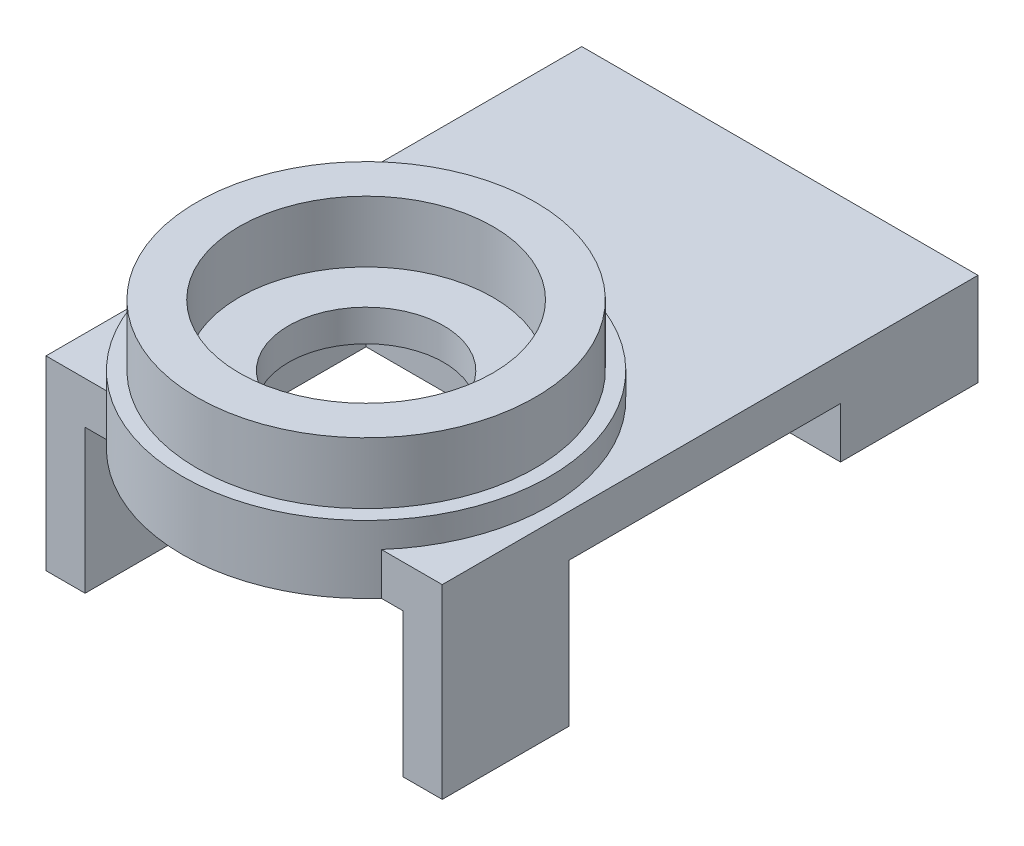
ISO-10303-21;
HEADER;
FILE_DESCRIPTION(('STEP AP214'),'2;1');
FILE_NAME('part.step','',(''),(''),'','','');
FILE_SCHEMA(('AUTOMOTIVE_DESIGN { 1 0 10303 214 1 1 1 1 }'));
ENDSEC;
DATA;
#1=APPLICATION_CONTEXT('core data for automotive mechanical design processes');
#2=APPLICATION_PROTOCOL_DEFINITION('international standard','automotive_design',2000,#1);
#3=PRODUCT_CONTEXT('',#1,'mechanical');
#4=PRODUCT('Part','Part','',(#3));
#5=PRODUCT_RELATED_PRODUCT_CATEGORY('part','',(#4));
#6=PRODUCT_DEFINITION_FORMATION('','',#4);
#7=PRODUCT_DEFINITION_CONTEXT('part definition',#1,'design');
#8=PRODUCT_DEFINITION('design','',#6,#7);
#9=PRODUCT_DEFINITION_SHAPE('','',#8);
#10=(LENGTH_UNIT() NAMED_UNIT(*) SI_UNIT(.MILLI.,.METRE.));
#11=(NAMED_UNIT(*) PLANE_ANGLE_UNIT() SI_UNIT($,.RADIAN.));
#12=(NAMED_UNIT(*) SI_UNIT($,.STERADIAN.) SOLID_ANGLE_UNIT());
#13=UNCERTAINTY_MEASURE_WITH_UNIT(LENGTH_MEASURE(1.E-05),#10,'distance_accuracy_value','');
#14=(GEOMETRIC_REPRESENTATION_CONTEXT(3) GLOBAL_UNCERTAINTY_ASSIGNED_CONTEXT((#13)) GLOBAL_UNIT_ASSIGNED_CONTEXT((#10,
#11,#12)) REPRESENTATION_CONTEXT('',''));
#15=CARTESIAN_POINT('',(0.,0.,0.));
#16=DIRECTION('',(0.,0.,1.));
#17=DIRECTION('',(1.,0.,0.));
#18=AXIS2_PLACEMENT_3D('',#15,#16,#17);
#19=CARTESIAN_POINT('',(0.,-1.7,0.));
#20=DIRECTION('',(0.,1.,0.));
#21=DIRECTION('',(0.,0.,1.));
#22=AXIS2_PLACEMENT_3D('',#19,#20,#21);
#23=PLANE('',#22);
#24=DIRECTION('',(0.,0.,-1.));
#25=VECTOR('',#24,1.);
#26=CARTESIAN_POINT('',(6.20485700421139,-1.7,0.));
#27=LINE('',#26,#25);
#28=CARTESIAN_POINT('',(6.20485700421139,-1.7,6.14875625654059));
#29=VERTEX_POINT('',#28);
#30=CARTESIAN_POINT('',(6.20485700421139,-1.7,-2.19124374345941));
#31=VERTEX_POINT('',#30);
#32=EDGE_CURVE('E283',#29,#31,#27,.T.);
#33=ORIENTED_EDGE('',*,*,#32,.T.);
#34=DIRECTION('',(-1.,0.,0.));
#35=VECTOR('',#34,1.);
#36=CARTESIAN_POINT('',(0.,-1.7,-2.19124374345941));
#37=LINE('',#36,#35);
#38=CARTESIAN_POINT('',(-2.13514299578861,-1.7,-2.19124374345941));
#39=VERTEX_POINT('',#38);
#40=EDGE_CURVE('E292',#31,#39,#37,.T.);
#41=ORIENTED_EDGE('',*,*,#40,.T.);
#42=DIRECTION('',(0.,0.,1.));
#43=VECTOR('',#42,1.);
#44=CARTESIAN_POINT('',(-2.13514299578861,-1.7,0.));
#45=LINE('',#44,#43);
#46=CARTESIAN_POINT('',(-2.13514299578861,-1.7,6.14875625654059));
#47=VERTEX_POINT('',#46);
#48=EDGE_CURVE('E290',#39,#47,#45,.T.);
#49=ORIENTED_EDGE('',*,*,#48,.T.);
#50=DIRECTION('',(1.,0.,0.));
#51=VECTOR('',#50,1.);
#52=CARTESIAN_POINT('',(0.,-1.7,6.14875625654059));
#53=LINE('',#52,#51);
#54=EDGE_CURVE('E288',#47,#29,#53,.T.);
#55=ORIENTED_EDGE('',*,*,#54,.T.);
#56=EDGE_LOOP('',(#33,#41,#49,#55));
#57=FACE_BOUND('',#56,.T.);
#58=DIRECTION('',(1.,0.,0.));
#59=VECTOR('',#58,1.);
#60=CARTESIAN_POINT('',(-7.33514299578861,-1.7,1.74875625654059));
#61=LINE('',#60,#59);
#62=CARTESIAN_POINT('',(-7.33514299578861,-1.7,1.74875625654059));
#63=VERTEX_POINT('',#62);
#64=CARTESIAN_POINT('',(-5.48514299578861,-1.7,1.74875625654059));
#65=VERTEX_POINT('',#64);
#66=EDGE_CURVE('E211',#63,#65,#61,.T.);
#67=ORIENTED_EDGE('',*,*,#66,.F.);
#68=DIRECTION('',(0.,0.,-1.));
#69=VECTOR('',#68,1.);
#70=CARTESIAN_POINT('',(-7.33514299578861,-1.7,0.));
#71=LINE('',#70,#69);
#72=CARTESIAN_POINT('',(-7.33514299578861,-1.7,-11.0912437434594));
#73=VERTEX_POINT('',#72);
#74=EDGE_CURVE('E190',#63,#73,#71,.T.);
#75=ORIENTED_EDGE('',*,*,#74,.T.);
#76=DIRECTION('',(-1.,0.,0.));
#77=VECTOR('',#76,1.);
#78=CARTESIAN_POINT('',(-7.33514299578861,-1.7,-11.0912437434594));
#79=LINE('',#78,#77);
#80=CARTESIAN_POINT('',(11.4048570042114,-1.7,-11.0912437434594));
#81=VERTEX_POINT('',#80);
#82=EDGE_CURVE('E191',#81,#73,#79,.T.);
#83=ORIENTED_EDGE('',*,*,#82,.F.);
#84=DIRECTION('',(0.,0.,-1.));
#85=VECTOR('',#84,1.);
#86=CARTESIAN_POINT('',(11.4048570042114,-1.7,0.));
#87=LINE('',#86,#85);
#88=CARTESIAN_POINT('',(11.4048570042114,-1.7,1.74875625654059));
#89=VERTEX_POINT('',#88);
#90=EDGE_CURVE('E252',#89,#81,#87,.T.);
#91=ORIENTED_EDGE('',*,*,#90,.F.);
#92=DIRECTION('',(1.,0.,0.));
#93=VECTOR('',#92,1.);
#94=CARTESIAN_POINT('',(11.4048570042114,-1.7,1.74875625654059));
#95=LINE('',#94,#93);
#96=CARTESIAN_POINT('',(9.55485700421139,-1.7,1.74875625654059));
#97=VERTEX_POINT('',#96);
#98=EDGE_CURVE('E206',#97,#89,#95,.T.);
#99=ORIENTED_EDGE('',*,*,#98,.F.);
#100=DIRECTION('',(0.,0.,-1.));
#101=VECTOR('',#100,1.);
#102=CARTESIAN_POINT('',(9.55485700421139,-1.7,7.74875625654059));
#103=LINE('',#102,#101);
#104=CARTESIAN_POINT('',(9.55485700421139,-1.7,7.74875625654059));
#105=VERTEX_POINT('',#104);
#106=EDGE_CURVE('E208',#105,#97,#103,.T.);
#107=ORIENTED_EDGE('',*,*,#106,.F.);
#108=DIRECTION('',(1.,0.,0.));
#109=VECTOR('',#108,1.);
#110=CARTESIAN_POINT('',(0.,-1.7,7.74875625654059));
#111=LINE('',#110,#109);
#112=CARTESIAN_POINT('',(8.52610688385707,-1.7,7.74875625654059));
#113=VERTEX_POINT('',#112);
#114=EDGE_CURVE('E254',#113,#105,#111,.T.);
#115=ORIENTED_EDGE('',*,*,#114,.F.);
#116=CARTESIAN_POINT('',(2.03485700421139,-1.7,1.97875625654059));
#117=DIRECTION('',(0.,1.,0.));
#118=DIRECTION('',(0.,0.,1.));
#119=AXIS2_PLACEMENT_3D('',#116,#117,#118);
#120=CIRCLE('',#119,8.685);
#121=CARTESIAN_POINT('',(-4.45639287543429,-1.7,7.74875625654059));
#122=VERTEX_POINT('',#121);
#123=EDGE_CURVE('E281',#122,#113,#120,.T.);
#124=ORIENTED_EDGE('',*,*,#123,.F.);
#125=DIRECTION('',(1.,0.,0.));
#126=VECTOR('',#125,1.);
#127=CARTESIAN_POINT('',(0.,-1.7,7.74875625654059));
#128=LINE('',#127,#126);
#129=CARTESIAN_POINT('',(-5.48514299578861,-1.7,7.74875625654059));
#130=VERTEX_POINT('',#129);
#131=EDGE_CURVE('E237',#130,#122,#128,.T.);
#132=ORIENTED_EDGE('',*,*,#131,.F.);
#133=DIRECTION('',(0.,0.,1.));
#134=VECTOR('',#133,1.);
#135=CARTESIAN_POINT('',(-5.48514299578861,-1.7,7.74875625654059));
#136=LINE('',#135,#134);
#137=EDGE_CURVE('E185',#65,#130,#136,.T.);
#138=ORIENTED_EDGE('',*,*,#137,.F.);
#139=EDGE_LOOP('',(#67,#75,#83,#91,#99,#107,#115,#124,#132,#138));
#140=FACE_BOUND('',#139,.T.);
#141=ADVANCED_FACE('F41',(#57,#140),#23,.F.);
#142=CARTESIAN_POINT('',(2.03485700421139,-1.7,1.97875625654059));
#143=DIRECTION('',(0.,1.,0.));
#144=DIRECTION('',(0.,0.,1.));
#145=AXIS2_PLACEMENT_3D('',#142,#143,#144);
#146=CYLINDRICAL_SURFACE('',#145,8.685);
#147=CARTESIAN_POINT('',(2.03485700421139,1.5,1.97875625654059));
#148=DIRECTION('',(0.,1.,0.));
#149=DIRECTION('',(0.,0.,1.));
#150=AXIS2_PLACEMENT_3D('',#147,#148,#149);
#151=CIRCLE('',#150,8.685);
#152=CARTESIAN_POINT('',(2.03485700421139,1.5,10.6637562565406));
#153=VERTEX_POINT('',#152);
#154=EDGE_CURVE('E278',#153,#153,#151,.T.);
#155=ORIENTED_EDGE('',*,*,#154,.F.);
#156=EDGE_LOOP('',(#155));
#157=FACE_BOUND('',#156,.T.);
#158=CARTESIAN_POINT('',(2.03485700421139,0.3,1.97875625654059));
#159=DIRECTION('',(0.,-1.,0.));
#160=DIRECTION('',(0.,0.,-1.));
#161=AXIS2_PLACEMENT_3D('',#158,#159,#160);
#162=CIRCLE('',#161,8.685);
#163=CARTESIAN_POINT('',(-4.45639287543429,0.3,7.74875625654059));
#164=VERTEX_POINT('',#163);
#165=CARTESIAN_POINT('',(8.52610688385707,0.3,7.74875625654059));
#166=VERTEX_POINT('',#165);
#167=EDGE_CURVE('E244',#164,#166,#162,.T.);
#168=ORIENTED_EDGE('',*,*,#167,.F.);
#169=DIRECTION('',(0.,-1.,0.));
#170=VECTOR('',#169,1.);
#171=CARTESIAN_POINT('',(-4.45639287543429,0.3,7.74875625654059));
#172=LINE('',#171,#170);
#173=EDGE_CURVE('E261',#164,#122,#172,.T.);
#174=ORIENTED_EDGE('',*,*,#173,.T.);
#175=ORIENTED_EDGE('',*,*,#123,.T.);
#176=DIRECTION('',(0.,-1.,0.));
#177=VECTOR('',#176,1.);
#178=CARTESIAN_POINT('',(8.52610688385707,0.3,7.74875625654059));
#179=LINE('',#178,#177);
#180=EDGE_CURVE('E264',#166,#113,#179,.T.);
#181=ORIENTED_EDGE('',*,*,#180,.F.);
#182=EDGE_LOOP('',(#168,#174,#175,#181));
#183=FACE_BOUND('',#182,.T.);
#184=ADVANCED_FACE('F353',(#157,#183),#146,.T.);
#185=CARTESIAN_POINT('',(0.,1.5,0.));
#186=DIRECTION('',(0.,-1.,0.));
#187=DIRECTION('',(0.,0.,-1.));
#188=AXIS2_PLACEMENT_3D('',#185,#186,#187);
#189=PLANE('',#188);
#190=CARTESIAN_POINT('',(2.03485700421139,1.5,1.97875625654059));
#191=DIRECTION('',(0.,1.,0.));
#192=DIRECTION('',(0.,0.,1.));
#193=AXIS2_PLACEMENT_3D('',#190,#191,#192);
#194=CIRCLE('',#193,3.67);
#195=CARTESIAN_POINT('',(2.03485700421139,1.5,5.64875625654059));
#196=VERTEX_POINT('',#195);
#197=EDGE_CURVE('E298',#196,#196,#194,.T.);
#198=ORIENTED_EDGE('',*,*,#197,.F.);
#199=EDGE_LOOP('',(#198));
#200=FACE_BOUND('',#199,.T.);
#201=CARTESIAN_POINT('',(2.03485700421139,1.5,1.97875625654059));
#202=DIRECTION('',(0.,1.,0.));
#203=DIRECTION('',(0.,0.,1.));
#204=AXIS2_PLACEMENT_3D('',#201,#202,#203);
#205=CIRCLE('',#204,6.);
#206=CARTESIAN_POINT('',(2.03485700421139,1.5,7.97875625654059));
#207=VERTEX_POINT('',#206);
#208=EDGE_CURVE('E260',#207,#207,#205,.T.);
#209=ORIENTED_EDGE('',*,*,#208,.T.);
#210=EDGE_LOOP('',(#209));
#211=FACE_BOUND('',#210,.T.);
#212=ADVANCED_FACE('F360',(#200,#211),#189,.F.);
#213=CARTESIAN_POINT('',(2.03485700421139,1.5,1.97875625654059));
#214=DIRECTION('',(0.,-1.,0.));
#215=DIRECTION('',(0.,0.,-1.));
#216=AXIS2_PLACEMENT_3D('',#213,#214,#215);
#217=CIRCLE('',#216,8.);
#218=CARTESIAN_POINT('',(2.03485700421139,1.5,-6.02124374345941));
#219=VERTEX_POINT('',#218);
#220=EDGE_CURVE('E11',#219,#219,#217,.F.);
#221=ORIENTED_EDGE('',*,*,#220,.F.);
#222=EDGE_LOOP('',(#221));
#223=FACE_BOUND('',#222,.T.);
#224=ORIENTED_EDGE('',*,*,#154,.T.);
#225=EDGE_LOOP('',(#224));
#226=FACE_BOUND('',#225,.T.);
#227=ADVANCED_FACE('F375',(#223,#226),#189,.F.);
#228=CARTESIAN_POINT('',(0.,0.,0.));
#229=DIRECTION('',(0.,-1.,0.));
#230=DIRECTION('',(0.,0.,-1.));
#231=AXIS2_PLACEMENT_3D('',#228,#229,#230);
#232=PLANE('',#231);
#233=CARTESIAN_POINT('',(2.03485700421139,0.,1.97875625654059));
#234=DIRECTION('',(0.,1.,0.));
#235=DIRECTION('',(0.,0.,1.));
#236=AXIS2_PLACEMENT_3D('',#233,#234,#235);
#237=CIRCLE('',#236,3.67);
#238=CARTESIAN_POINT('',(2.03485700421139,0.,5.64875625654059));
#239=VERTEX_POINT('',#238);
#240=EDGE_CURVE('E307',#239,#239,#237,.T.);
#241=ORIENTED_EDGE('',*,*,#240,.T.);
#242=EDGE_LOOP('',(#241));
#243=FACE_BOUND('',#242,.T.);
#244=DIRECTION('',(0.,0.,1.));
#245=VECTOR('',#244,1.);
#246=CARTESIAN_POINT('',(-2.13514299578861,0.,6.14875625654059));
#247=LINE('',#246,#245);
#248=CARTESIAN_POINT('',(-2.13514299578861,0.,-2.19124374345941));
#249=VERTEX_POINT('',#248);
#250=CARTESIAN_POINT('',(-2.13514299578861,0.,6.14875625654059));
#251=VERTEX_POINT('',#250);
#252=EDGE_CURVE('E310',#249,#251,#247,.T.);
#253=ORIENTED_EDGE('',*,*,#252,.F.);
#254=DIRECTION('',(-1.,0.,0.));
#255=VECTOR('',#254,1.);
#256=CARTESIAN_POINT('',(-2.13514299578861,0.,-2.19124374345941));
#257=LINE('',#256,#255);
#258=CARTESIAN_POINT('',(6.20485700421139,0.,-2.19124374345941));
#259=VERTEX_POINT('',#258);
#260=EDGE_CURVE('E49',#259,#249,#257,.T.);
#261=ORIENTED_EDGE('',*,*,#260,.F.);
#262=DIRECTION('',(0.,0.,-1.));
#263=VECTOR('',#262,1.);
#264=CARTESIAN_POINT('',(6.20485700421139,0.,6.14875625654059));
#265=LINE('',#264,#263);
#266=CARTESIAN_POINT('',(6.20485700421139,0.,6.14875625654059));
#267=VERTEX_POINT('',#266);
#268=EDGE_CURVE('E318',#267,#259,#265,.T.);
#269=ORIENTED_EDGE('',*,*,#268,.F.);
#270=DIRECTION('',(1.,0.,0.));
#271=VECTOR('',#270,1.);
#272=CARTESIAN_POINT('',(-2.13514299578861,0.,6.14875625654059));
#273=LINE('',#272,#271);
#274=EDGE_CURVE('E315',#251,#267,#273,.T.);
#275=ORIENTED_EDGE('',*,*,#274,.F.);
#276=EDGE_LOOP('',(#253,#261,#269,#275));
#277=FACE_BOUND('',#276,.T.);
#278=ADVANCED_FACE('F43',(#243,#277),#232,.T.);
#279=CARTESIAN_POINT('',(2.03485700421139,0.,1.97875625654059));
#280=DIRECTION('',(0.,1.,0.));
#281=DIRECTION('',(0.,0.,1.));
#282=AXIS2_PLACEMENT_3D('',#279,#280,#281);
#283=CYLINDRICAL_SURFACE('',#282,3.67);
#284=ORIENTED_EDGE('',*,*,#240,.F.);
#285=EDGE_LOOP('',(#284));
#286=FACE_BOUND('',#285,.T.);
#287=ORIENTED_EDGE('',*,*,#197,.T.);
#288=EDGE_LOOP('',(#287));
#289=FACE_BOUND('',#288,.T.);
#290=ADVANCED_FACE('F368',(#286,#289),#283,.F.);
#291=CARTESIAN_POINT('',(6.20485700421139,-1.7,0.));
#292=DIRECTION('',(1.,0.,0.));
#293=DIRECTION('',(0.,0.,-1.));
#294=AXIS2_PLACEMENT_3D('',#291,#292,#293);
#295=PLANE('',#294);
#296=ORIENTED_EDGE('',*,*,#268,.T.);
#297=DIRECTION('',(0.,1.,0.));
#298=VECTOR('',#297,1.);
#299=CARTESIAN_POINT('',(6.20485700421139,-1.7,-2.19124374345941));
#300=LINE('',#299,#298);
#301=EDGE_CURVE('E295',#31,#259,#300,.T.);
#302=ORIENTED_EDGE('',*,*,#301,.F.);
#303=ORIENTED_EDGE('',*,*,#32,.F.);
#304=DIRECTION('',(0.,1.,0.));
#305=VECTOR('',#304,1.);
#306=CARTESIAN_POINT('',(6.20485700421139,-1.7,6.14875625654059));
#307=LINE('',#306,#305);
#308=EDGE_CURVE('E294',#29,#267,#307,.T.);
#309=ORIENTED_EDGE('',*,*,#308,.T.);
#310=EDGE_LOOP('',(#296,#302,#303,#309));
#311=FACE_BOUND('',#310,.T.);
#312=ADVANCED_FACE('F336',(#311),#295,.F.);
#313=CARTESIAN_POINT('',(0.,-1.7,-2.19124374345941));
#314=DIRECTION('',(0.,0.,-1.));
#315=DIRECTION('',(-1.,0.,0.));
#316=AXIS2_PLACEMENT_3D('',#313,#314,#315);
#317=PLANE('',#316);
#318=ORIENTED_EDGE('',*,*,#260,.T.);
#319=DIRECTION('',(0.,1.,0.));
#320=VECTOR('',#319,1.);
#321=CARTESIAN_POINT('',(-2.13514299578861,-1.7,-2.19124374345941));
#322=LINE('',#321,#320);
#323=EDGE_CURVE('E299',#39,#249,#322,.T.);
#324=ORIENTED_EDGE('',*,*,#323,.F.);
#325=ORIENTED_EDGE('',*,*,#40,.F.);
#326=ORIENTED_EDGE('',*,*,#301,.T.);
#327=EDGE_LOOP('',(#318,#324,#325,#326));
#328=FACE_BOUND('',#327,.T.);
#329=ADVANCED_FACE('F323',(#328),#317,.F.);
#330=CARTESIAN_POINT('',(-2.13514299578861,-1.7,0.));
#331=DIRECTION('',(-1.,0.,0.));
#332=DIRECTION('',(0.,0.,1.));
#333=AXIS2_PLACEMENT_3D('',#330,#331,#332);
#334=PLANE('',#333);
#335=ORIENTED_EDGE('',*,*,#252,.T.);
#336=DIRECTION('',(0.,1.,0.));
#337=VECTOR('',#336,1.);
#338=CARTESIAN_POINT('',(-2.13514299578861,-1.7,6.14875625654059));
#339=LINE('',#338,#337);
#340=EDGE_CURVE('E302',#47,#251,#339,.T.);
#341=ORIENTED_EDGE('',*,*,#340,.F.);
#342=ORIENTED_EDGE('',*,*,#48,.F.);
#343=ORIENTED_EDGE('',*,*,#323,.T.);
#344=EDGE_LOOP('',(#335,#341,#342,#343));
#345=FACE_BOUND('',#344,.T.);
#346=ADVANCED_FACE('F328',(#345),#334,.F.);
#347=CARTESIAN_POINT('',(0.,-1.7,6.14875625654059));
#348=DIRECTION('',(0.,0.,1.));
#349=DIRECTION('',(1.,0.,0.));
#350=AXIS2_PLACEMENT_3D('',#347,#348,#349);
#351=PLANE('',#350);
#352=ORIENTED_EDGE('',*,*,#274,.T.);
#353=ORIENTED_EDGE('',*,*,#308,.F.);
#354=ORIENTED_EDGE('',*,*,#54,.F.);
#355=ORIENTED_EDGE('',*,*,#340,.T.);
#356=EDGE_LOOP('',(#352,#353,#354,#355));
#357=FACE_BOUND('',#356,.T.);
#358=ADVANCED_FACE('F338',(#357),#351,.F.);
#359=CARTESIAN_POINT('',(2.03485700421139,4.4,1.97875625654059));
#360=DIRECTION('',(0.,-1.,0.));
#361=DIRECTION('',(0.,0.,-1.));
#362=AXIS2_PLACEMENT_3D('',#359,#360,#361);
#363=CYLINDRICAL_SURFACE('',#362,6.);
#364=CARTESIAN_POINT('',(2.03485700421139,4.4,1.97875625654059));
#365=DIRECTION('',(0.,1.,0.));
#366=DIRECTION('',(0.,0.,1.));
#367=AXIS2_PLACEMENT_3D('',#364,#365,#366);
#368=CIRCLE('',#367,6.);
#369=CARTESIAN_POINT('',(2.03485700421139,4.4,7.97875625654059));
#370=VERTEX_POINT('',#369);
#371=EDGE_CURVE('E272',#370,#370,#368,.T.);
#372=ORIENTED_EDGE('',*,*,#371,.T.);
#373=EDGE_LOOP('',(#372));
#374=FACE_BOUND('',#373,.T.);
#375=ORIENTED_EDGE('',*,*,#208,.F.);
#376=EDGE_LOOP('',(#375));
#377=FACE_BOUND('',#376,.T.);
#378=ADVANCED_FACE('F340',(#374,#377),#363,.F.);
#379=CARTESIAN_POINT('',(2.03485700421139,4.4,1.97875625654059));
#380=DIRECTION('',(0.,-1.,0.));
#381=DIRECTION('',(0.,0.,-1.));
#382=AXIS2_PLACEMENT_3D('',#379,#380,#381);
#383=CYLINDRICAL_SURFACE('',#382,8.);
#384=CARTESIAN_POINT('',(2.03485700421139,4.4,1.97875625654059));
#385=DIRECTION('',(0.,1.,0.));
#386=DIRECTION('',(0.,0.,1.));
#387=AXIS2_PLACEMENT_3D('',#384,#385,#386);
#388=CIRCLE('',#387,8.);
#389=CARTESIAN_POINT('',(2.03485700421139,4.4,9.97875625654059));
#390=VERTEX_POINT('',#389);
#391=EDGE_CURVE('E275',#390,#390,#388,.T.);
#392=ORIENTED_EDGE('',*,*,#391,.F.);
#393=EDGE_LOOP('',(#392));
#394=FACE_BOUND('',#393,.T.);
#395=ORIENTED_EDGE('',*,*,#220,.T.);
#396=EDGE_LOOP('',(#395));
#397=FACE_BOUND('',#396,.T.);
#398=ADVANCED_FACE('F347',(#394,#397),#383,.T.);
#399=CARTESIAN_POINT('',(0.,4.4,0.));
#400=DIRECTION('',(0.,1.,0.));
#401=DIRECTION('',(0.,0.,1.));
#402=AXIS2_PLACEMENT_3D('',#399,#400,#401);
#403=PLANE('',#402);
#404=ORIENTED_EDGE('',*,*,#371,.F.);
#405=EDGE_LOOP('',(#404));
#406=FACE_BOUND('',#405,.T.);
#407=ORIENTED_EDGE('',*,*,#391,.T.);
#408=EDGE_LOOP('',(#407));
#409=FACE_BOUND('',#408,.T.);
#410=ADVANCED_FACE('F461',(#406,#409),#403,.T.);
#411=CARTESIAN_POINT('',(-7.33514299578861,0.3,0.));
#412=DIRECTION('',(-1.,0.,0.));
#413=DIRECTION('',(0.,0.,1.));
#414=AXIS2_PLACEMENT_3D('',#411,#412,#413);
#415=PLANE('',#414);
#416=ORIENTED_EDGE('',*,*,#74,.F.);
#417=DIRECTION('',(0.,1.,0.));
#418=VECTOR('',#417,1.);
#419=CARTESIAN_POINT('',(-7.33514299578861,-8.5,1.74875625654059));
#420=LINE('',#419,#418);
#421=CARTESIAN_POINT('',(-7.33514299578861,-8.5,1.74875625654059));
#422=VERTEX_POINT('',#421);
#423=EDGE_CURVE('E171',#422,#63,#420,.T.);
#424=ORIENTED_EDGE('',*,*,#423,.F.);
#425=DIRECTION('',(0.,0.,-1.));
#426=VECTOR('',#425,1.);
#427=CARTESIAN_POINT('',(-7.33514299578861,-8.5,7.74875625654059));
#428=LINE('',#427,#426);
#429=CARTESIAN_POINT('',(-7.33514299578861,-8.5,7.74875625654059));
#430=VERTEX_POINT('',#429);
#431=EDGE_CURVE('E178',#430,#422,#428,.T.);
#432=ORIENTED_EDGE('',*,*,#431,.F.);
#433=DIRECTION('',(0.,-1.,0.));
#434=VECTOR('',#433,1.);
#435=CARTESIAN_POINT('',(-7.33514299578861,0.3,7.74875625654059));
#436=LINE('',#435,#434);
#437=CARTESIAN_POINT('',(-7.33514299578861,0.3,7.74875625654059));
#438=VERTEX_POINT('',#437);
#439=EDGE_CURVE('E258',#438,#430,#436,.T.);
#440=ORIENTED_EDGE('',*,*,#439,.F.);
#441=DIRECTION('',(0.,0.,-1.));
#442=VECTOR('',#441,1.);
#443=CARTESIAN_POINT('',(-7.33514299578861,0.3,0.));
#444=LINE('',#443,#442);
#445=CARTESIAN_POINT('',(-7.33514299578861,0.3,-17.5912437434594));
#446=VERTEX_POINT('',#445);
#447=EDGE_CURVE('E233',#438,#446,#444,.T.);
#448=ORIENTED_EDGE('',*,*,#447,.T.);
#449=DIRECTION('',(0.,-1.,0.));
#450=VECTOR('',#449,1.);
#451=CARTESIAN_POINT('',(-7.33514299578861,0.3,-17.5912437434594));
#452=LINE('',#451,#450);
#453=CARTESIAN_POINT('',(-7.33514299578861,-4.1,-17.5912437434594));
#454=VERTEX_POINT('',#453);
#455=EDGE_CURVE('E250',#446,#454,#452,.T.);
#456=ORIENTED_EDGE('',*,*,#455,.T.);
#457=DIRECTION('',(0.,0.,-1.));
#458=VECTOR('',#457,1.);
#459=CARTESIAN_POINT('',(-7.33514299578861,-4.1,-17.5912437434594));
#460=LINE('',#459,#458);
#461=CARTESIAN_POINT('',(-7.33514299578861,-4.1,-11.0912437434594));
#462=VERTEX_POINT('',#461);
#463=EDGE_CURVE('E194',#462,#454,#460,.T.);
#464=ORIENTED_EDGE('',*,*,#463,.F.);
#465=DIRECTION('',(0.,1.,0.));
#466=VECTOR('',#465,1.);
#467=CARTESIAN_POINT('',(-7.33514299578861,-4.1,-11.0912437434594));
#468=LINE('',#467,#466);
#469=EDGE_CURVE('E227',#462,#73,#468,.T.);
#470=ORIENTED_EDGE('',*,*,#469,.T.);
#471=EDGE_LOOP('',(#416,#424,#432,#440,#448,#456,#464,#470));
#472=FACE_BOUND('',#471,.T.);
#473=ADVANCED_FACE('F188',(#472),#415,.T.);
#474=CARTESIAN_POINT('',(0.,0.3,7.74875625654059));
#475=DIRECTION('',(0.,0.,-1.));
#476=DIRECTION('',(-1.,0.,0.));
#477=AXIS2_PLACEMENT_3D('',#474,#475,#476);
#478=PLANE('',#477);
#479=ORIENTED_EDGE('',*,*,#439,.T.);
#480=DIRECTION('',(-1.,0.,0.));
#481=VECTOR('',#480,1.);
#482=CARTESIAN_POINT('',(-7.33514299578861,-8.5,7.74875625654059));
#483=LINE('',#482,#481);
#484=CARTESIAN_POINT('',(-5.48514299578861,-8.5,7.74875625654059));
#485=VERTEX_POINT('',#484);
#486=EDGE_CURVE('E183',#485,#430,#483,.T.);
#487=ORIENTED_EDGE('',*,*,#486,.F.);
#488=DIRECTION('',(0.,1.,0.));
#489=VECTOR('',#488,1.);
#490=CARTESIAN_POINT('',(-5.48514299578861,-8.5,7.74875625654059));
#491=LINE('',#490,#489);
#492=EDGE_CURVE('E56',#485,#130,#491,.T.);
#493=ORIENTED_EDGE('',*,*,#492,.T.);
#494=ORIENTED_EDGE('',*,*,#131,.T.);
#495=ORIENTED_EDGE('',*,*,#173,.F.);
#496=DIRECTION('',(1.,0.,0.));
#497=VECTOR('',#496,1.);
#498=CARTESIAN_POINT('',(0.,0.3,7.74875625654059));
#499=LINE('',#498,#497);
#500=EDGE_CURVE('E247',#438,#164,#499,.T.);
#501=ORIENTED_EDGE('',*,*,#500,.F.);
#502=EDGE_LOOP('',(#479,#487,#493,#494,#495,#501));
#503=FACE_BOUND('',#502,.T.);
#504=ADVANCED_FACE('F393',(#503),#478,.F.);
#505=CARTESIAN_POINT('',(0.,0.3,7.74875625654059));
#506=DIRECTION('',(0.,0.,-1.));
#507=DIRECTION('',(-1.,0.,0.));
#508=AXIS2_PLACEMENT_3D('',#505,#506,#507);
#509=PLANE('',#508);
#510=ORIENTED_EDGE('',*,*,#114,.T.);
#511=DIRECTION('',(0.,1.,0.));
#512=VECTOR('',#511,1.);
#513=CARTESIAN_POINT('',(9.55485700421139,-8.5,7.74875625654059));
#514=LINE('',#513,#512);
#515=CARTESIAN_POINT('',(9.55485700421139,-8.5,7.74875625654059));
#516=VERTEX_POINT('',#515);
#517=EDGE_CURVE('E199',#516,#105,#514,.T.);
#518=ORIENTED_EDGE('',*,*,#517,.F.);
#519=DIRECTION('',(-1.,0.,0.));
#520=VECTOR('',#519,1.);
#521=CARTESIAN_POINT('',(11.4048570042114,-8.5,7.74875625654059));
#522=LINE('',#521,#520);
#523=CARTESIAN_POINT('',(11.4048570042114,-8.5,7.74875625654059));
#524=VERTEX_POINT('',#523);
#525=EDGE_CURVE('E215',#524,#516,#522,.T.);
#526=ORIENTED_EDGE('',*,*,#525,.F.);
#527=DIRECTION('',(0.,-1.,0.));
#528=VECTOR('',#527,1.);
#529=CARTESIAN_POINT('',(11.4048570042114,0.3,7.74875625654059));
#530=LINE('',#529,#528);
#531=CARTESIAN_POINT('',(11.4048570042114,0.3,7.74875625654059));
#532=VERTEX_POINT('',#531);
#533=EDGE_CURVE('E267',#532,#524,#530,.T.);
#534=ORIENTED_EDGE('',*,*,#533,.F.);
#535=DIRECTION('',(1.,0.,0.));
#536=VECTOR('',#535,1.);
#537=CARTESIAN_POINT('',(0.,0.3,7.74875625654059));
#538=LINE('',#537,#536);
#539=EDGE_CURVE('E242',#166,#532,#538,.T.);
#540=ORIENTED_EDGE('',*,*,#539,.F.);
#541=ORIENTED_EDGE('',*,*,#180,.T.);
#542=EDGE_LOOP('',(#510,#518,#526,#534,#540,#541));
#543=FACE_BOUND('',#542,.T.);
#544=ADVANCED_FACE('F400',(#543),#509,.F.);
#545=CARTESIAN_POINT('',(11.4048570042114,0.3,0.));
#546=DIRECTION('',(-1.,0.,0.));
#547=DIRECTION('',(0.,0.,1.));
#548=AXIS2_PLACEMENT_3D('',#545,#546,#547);
#549=PLANE('',#548);
#550=ORIENTED_EDGE('',*,*,#533,.T.);
#551=DIRECTION('',(0.,0.,1.));
#552=VECTOR('',#551,1.);
#553=CARTESIAN_POINT('',(11.4048570042114,-8.5,7.74875625654059));
#554=LINE('',#553,#552);
#555=CARTESIAN_POINT('',(11.4048570042114,-8.5,1.74875625654059));
#556=VERTEX_POINT('',#555);
#557=EDGE_CURVE('E209',#556,#524,#554,.T.);
#558=ORIENTED_EDGE('',*,*,#557,.F.);
#559=DIRECTION('',(0.,1.,0.));
#560=VECTOR('',#559,1.);
#561=CARTESIAN_POINT('',(11.4048570042114,-8.5,1.74875625654059));
#562=LINE('',#561,#560);
#563=EDGE_CURVE('E64',#556,#89,#562,.T.);
#564=ORIENTED_EDGE('',*,*,#563,.T.);
#565=ORIENTED_EDGE('',*,*,#90,.T.);
#566=DIRECTION('',(0.,1.,0.));
#567=VECTOR('',#566,1.);
#568=CARTESIAN_POINT('',(11.4048570042114,-4.1,-11.0912437434594));
#569=LINE('',#568,#567);
#570=CARTESIAN_POINT('',(11.4048570042114,-4.1,-11.0912437434594));
#571=VERTEX_POINT('',#570);
#572=EDGE_CURVE('E230',#571,#81,#569,.T.);
#573=ORIENTED_EDGE('',*,*,#572,.F.);
#574=DIRECTION('',(0.,0.,1.));
#575=VECTOR('',#574,1.);
#576=CARTESIAN_POINT('',(11.4048570042114,-4.1,-17.5912437434594));
#577=LINE('',#576,#575);
#578=CARTESIAN_POINT('',(11.4048570042114,-4.1,-17.5912437434594));
#579=VERTEX_POINT('',#578);
#580=EDGE_CURVE('E224',#579,#571,#577,.T.);
#581=ORIENTED_EDGE('',*,*,#580,.F.);
#582=DIRECTION('',(0.,-1.,0.));
#583=VECTOR('',#582,1.);
#584=CARTESIAN_POINT('',(11.4048570042114,0.3,-17.5912437434594));
#585=LINE('',#584,#583);
#586=CARTESIAN_POINT('',(11.4048570042114,0.3,-17.5912437434594));
#587=VERTEX_POINT('',#586);
#588=EDGE_CURVE('E269',#587,#579,#585,.T.);
#589=ORIENTED_EDGE('',*,*,#588,.F.);
#590=DIRECTION('',(0.,0.,-1.));
#591=VECTOR('',#590,1.);
#592=CARTESIAN_POINT('',(11.4048570042114,0.3,0.));
#593=LINE('',#592,#591);
#594=EDGE_CURVE('E240',#532,#587,#593,.T.);
#595=ORIENTED_EDGE('',*,*,#594,.F.);
#596=EDGE_LOOP('',(#550,#558,#564,#565,#573,#581,#589,#595));
#597=FACE_BOUND('',#596,.T.);
#598=ADVANCED_FACE('F407',(#597),#549,.F.);
#599=CARTESIAN_POINT('',(0.,0.3,-17.5912437434594));
#600=DIRECTION('',(0.,0.,-1.));
#601=DIRECTION('',(-1.,0.,0.));
#602=AXIS2_PLACEMENT_3D('',#599,#600,#601);
#603=PLANE('',#602);
#604=ORIENTED_EDGE('',*,*,#588,.T.);
#605=DIRECTION('',(1.,0.,0.));
#606=VECTOR('',#605,1.);
#607=CARTESIAN_POINT('',(-7.33514299578861,-4.1,-17.5912437434594));
#608=LINE('',#607,#606);
#609=EDGE_CURVE('E221',#454,#579,#608,.T.);
#610=ORIENTED_EDGE('',*,*,#609,.F.);
#611=ORIENTED_EDGE('',*,*,#455,.F.);
#612=DIRECTION('',(1.,0.,0.));
#613=VECTOR('',#612,1.);
#614=CARTESIAN_POINT('',(0.,0.3,-17.5912437434594));
#615=LINE('',#614,#613);
#616=EDGE_CURVE('E236',#446,#587,#615,.T.);
#617=ORIENTED_EDGE('',*,*,#616,.T.);
#618=EDGE_LOOP('',(#604,#610,#611,#617));
#619=FACE_BOUND('',#618,.T.);
#620=ADVANCED_FACE('F411',(#619),#603,.T.);
#621=CARTESIAN_POINT('',(0.,0.3,0.));
#622=DIRECTION('',(0.,-1.,0.));
#623=DIRECTION('',(0.,0.,-1.));
#624=AXIS2_PLACEMENT_3D('',#621,#622,#623);
#625=PLANE('',#624);
#626=ORIENTED_EDGE('',*,*,#447,.F.);
#627=ORIENTED_EDGE('',*,*,#500,.T.);
#628=ORIENTED_EDGE('',*,*,#167,.T.);
#629=ORIENTED_EDGE('',*,*,#539,.T.);
#630=ORIENTED_EDGE('',*,*,#594,.T.);
#631=ORIENTED_EDGE('',*,*,#616,.F.);
#632=EDGE_LOOP('',(#626,#627,#628,#629,#630,#631));
#633=FACE_BOUND('',#632,.T.);
#634=ADVANCED_FACE('F391',(#633),#625,.F.);
#635=CARTESIAN_POINT('',(-7.33514299578861,-4.1,-11.0912437434594));
#636=DIRECTION('',(0.,0.,-1.));
#637=DIRECTION('',(-1.,0.,0.));
#638=AXIS2_PLACEMENT_3D('',#635,#636,#637);
#639=PLANE('',#638);
#640=ORIENTED_EDGE('',*,*,#82,.T.);
#641=ORIENTED_EDGE('',*,*,#469,.F.);
#642=DIRECTION('',(-1.,0.,0.));
#643=VECTOR('',#642,1.);
#644=CARTESIAN_POINT('',(-7.33514299578861,-4.1,-11.0912437434594));
#645=LINE('',#644,#643);
#646=EDGE_CURVE('E226',#571,#462,#645,.T.);
#647=ORIENTED_EDGE('',*,*,#646,.F.);
#648=ORIENTED_EDGE('',*,*,#572,.T.);
#649=EDGE_LOOP('',(#640,#641,#647,#648));
#650=FACE_BOUND('',#649,.T.);
#651=ADVANCED_FACE('F423',(#650),#639,.F.);
#652=CARTESIAN_POINT('',(0.,-4.1,0.));
#653=DIRECTION('',(0.,1.,0.));
#654=DIRECTION('',(0.,0.,1.));
#655=AXIS2_PLACEMENT_3D('',#652,#653,#654);
#656=PLANE('',#655);
#657=ORIENTED_EDGE('',*,*,#463,.T.);
#658=ORIENTED_EDGE('',*,*,#609,.T.);
#659=ORIENTED_EDGE('',*,*,#580,.T.);
#660=ORIENTED_EDGE('',*,*,#646,.T.);
#661=EDGE_LOOP('',(#657,#658,#659,#660));
#662=FACE_BOUND('',#661,.T.);
#663=ADVANCED_FACE('F445',(#662),#656,.F.);
#664=CARTESIAN_POINT('',(9.55485700421139,-8.5,7.74875625654059));
#665=DIRECTION('',(1.,0.,0.));
#666=DIRECTION('',(0.,0.,-1.));
#667=AXIS2_PLACEMENT_3D('',#664,#665,#666);
#668=PLANE('',#667);
#669=ORIENTED_EDGE('',*,*,#106,.T.);
#670=DIRECTION('',(0.,1.,0.));
#671=VECTOR('',#670,1.);
#672=CARTESIAN_POINT('',(9.55485700421139,-8.5,1.74875625654059));
#673=LINE('',#672,#671);
#674=CARTESIAN_POINT('',(9.55485700421139,-8.5,1.74875625654059));
#675=VERTEX_POINT('',#674);
#676=EDGE_CURVE('E201',#675,#97,#673,.T.);
#677=ORIENTED_EDGE('',*,*,#676,.F.);
#678=DIRECTION('',(0.,0.,-1.));
#679=VECTOR('',#678,1.);
#680=CARTESIAN_POINT('',(9.55485700421139,-8.5,7.74875625654059));
#681=LINE('',#680,#679);
#682=EDGE_CURVE('E213',#516,#675,#681,.T.);
#683=ORIENTED_EDGE('',*,*,#682,.F.);
#684=ORIENTED_EDGE('',*,*,#517,.T.);
#685=EDGE_LOOP('',(#669,#677,#683,#684));
#686=FACE_BOUND('',#685,.T.);
#687=ADVANCED_FACE('F432',(#686),#668,.F.);
#688=CARTESIAN_POINT('',(11.4048570042114,-8.5,1.74875625654059));
#689=DIRECTION('',(0.,0.,1.));
#690=DIRECTION('',(1.,0.,0.));
#691=AXIS2_PLACEMENT_3D('',#688,#689,#690);
#692=PLANE('',#691);
#693=ORIENTED_EDGE('',*,*,#98,.T.);
#694=ORIENTED_EDGE('',*,*,#563,.F.);
#695=DIRECTION('',(1.,0.,0.));
#696=VECTOR('',#695,1.);
#697=CARTESIAN_POINT('',(11.4048570042114,-8.5,1.74875625654059));
#698=LINE('',#697,#696);
#699=EDGE_CURVE('E205',#675,#556,#698,.T.);
#700=ORIENTED_EDGE('',*,*,#699,.F.);
#701=ORIENTED_EDGE('',*,*,#676,.T.);
#702=EDGE_LOOP('',(#693,#694,#700,#701));
#703=FACE_BOUND('',#702,.T.);
#704=ADVANCED_FACE('F427',(#703),#692,.F.);
#705=CARTESIAN_POINT('',(0.,-8.5,0.));
#706=DIRECTION('',(0.,1.,0.));
#707=DIRECTION('',(0.,0.,1.));
#708=AXIS2_PLACEMENT_3D('',#705,#706,#707);
#709=PLANE('',#708);
#710=ORIENTED_EDGE('',*,*,#557,.T.);
#711=ORIENTED_EDGE('',*,*,#525,.T.);
#712=ORIENTED_EDGE('',*,*,#682,.T.);
#713=ORIENTED_EDGE('',*,*,#699,.T.);
#714=EDGE_LOOP('',(#710,#711,#712,#713));
#715=FACE_BOUND('',#714,.T.);
#716=ADVANCED_FACE('F434',(#715),#709,.F.);
#717=CARTESIAN_POINT('',(-7.33514299578861,-8.5,1.74875625654059));
#718=DIRECTION('',(0.,0.,1.));
#719=DIRECTION('',(1.,0.,0.));
#720=AXIS2_PLACEMENT_3D('',#717,#718,#719);
#721=PLANE('',#720);
#722=ORIENTED_EDGE('',*,*,#66,.T.);
#723=DIRECTION('',(0.,1.,0.));
#724=VECTOR('',#723,1.);
#725=CARTESIAN_POINT('',(-5.48514299578861,-8.5,1.74875625654059));
#726=LINE('',#725,#724);
#727=CARTESIAN_POINT('',(-5.48514299578861,-8.5,1.74875625654059));
#728=VERTEX_POINT('',#727);
#729=EDGE_CURVE('E174',#728,#65,#726,.T.);
#730=ORIENTED_EDGE('',*,*,#729,.F.);
#731=DIRECTION('',(1.,0.,0.));
#732=VECTOR('',#731,1.);
#733=CARTESIAN_POINT('',(-7.33514299578861,-8.5,1.74875625654059));
#734=LINE('',#733,#732);
#735=EDGE_CURVE('E167',#422,#728,#734,.T.);
#736=ORIENTED_EDGE('',*,*,#735,.F.);
#737=ORIENTED_EDGE('',*,*,#423,.T.);
#738=EDGE_LOOP('',(#722,#730,#736,#737));
#739=FACE_BOUND('',#738,.T.);
#740=ADVANCED_FACE('F169',(#739),#721,.F.);
#741=CARTESIAN_POINT('',(-5.48514299578861,-8.5,7.74875625654059));
#742=DIRECTION('',(-1.,0.,0.));
#743=DIRECTION('',(0.,0.,1.));
#744=AXIS2_PLACEMENT_3D('',#741,#742,#743);
#745=PLANE('',#744);
#746=ORIENTED_EDGE('',*,*,#137,.T.);
#747=ORIENTED_EDGE('',*,*,#492,.F.);
#748=DIRECTION('',(0.,0.,1.));
#749=VECTOR('',#748,1.);
#750=CARTESIAN_POINT('',(-5.48514299578861,-8.5,7.74875625654059));
#751=LINE('',#750,#749);
#752=EDGE_CURVE('E177',#728,#485,#751,.T.);
#753=ORIENTED_EDGE('',*,*,#752,.F.);
#754=ORIENTED_EDGE('',*,*,#729,.T.);
#755=EDGE_LOOP('',(#746,#747,#753,#754));
#756=FACE_BOUND('',#755,.T.);
#757=ADVANCED_FACE('F418',(#756),#745,.F.);
#758=CARTESIAN_POINT('',(0.,-8.5,0.));
#759=DIRECTION('',(0.,-1.,0.));
#760=DIRECTION('',(0.,0.,-1.));
#761=AXIS2_PLACEMENT_3D('',#758,#759,#760);
#762=PLANE('',#761);
#763=ORIENTED_EDGE('',*,*,#431,.T.);
#764=ORIENTED_EDGE('',*,*,#735,.T.);
#765=ORIENTED_EDGE('',*,*,#752,.T.);
#766=ORIENTED_EDGE('',*,*,#486,.T.);
#767=EDGE_LOOP('',(#763,#764,#765,#766));
#768=FACE_BOUND('',#767,.T.);
#769=ADVANCED_FACE('F182',(#768),#762,.T.);
#770=CLOSED_SHELL('',(#141,#184,#212,#227,#278,#290,#312,#329,#346,#358,#378,#398,#410,#473,
#504,#544,#598,#620,#634,#651,#663,#687,#704,#716,#740,#757,#769));
#771=MANIFOLD_SOLID_BREP('B2',#770);
#772=ADVANCED_BREP_SHAPE_REPRESENTATION('',(#18,#771),#14);
#773=SHAPE_DEFINITION_REPRESENTATION(#9,#772);
ENDSEC;
END-ISO-10303-21;
